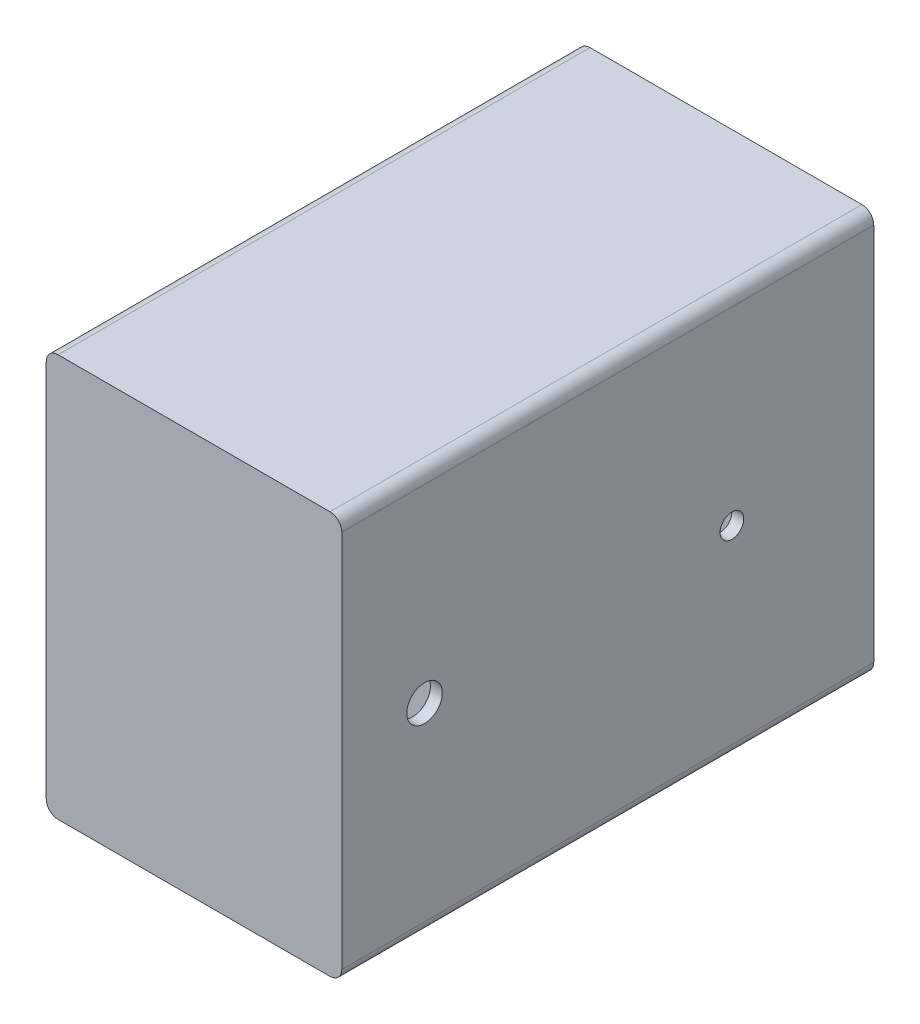
ISO-10303-21;
HEADER;
FILE_DESCRIPTION(('STEP AP214'),'2;1');
FILE_NAME('part.step','',(''),(''),'','','');
FILE_SCHEMA(('AUTOMOTIVE_DESIGN { 1 0 10303 214 1 1 1 1 }'));
ENDSEC;
DATA;
#1=APPLICATION_CONTEXT('core data for automotive mechanical design processes');
#2=APPLICATION_PROTOCOL_DEFINITION('international standard','automotive_design',2000,#1);
#3=PRODUCT_CONTEXT('',#1,'mechanical');
#4=PRODUCT('Part','Part','',(#3));
#5=PRODUCT_RELATED_PRODUCT_CATEGORY('part','',(#4));
#6=PRODUCT_DEFINITION_FORMATION('','',#4);
#7=PRODUCT_DEFINITION_CONTEXT('part definition',#1,'design');
#8=PRODUCT_DEFINITION('design','',#6,#7);
#9=PRODUCT_DEFINITION_SHAPE('','',#8);
#10=(LENGTH_UNIT() NAMED_UNIT(*) SI_UNIT(.MILLI.,.METRE.));
#11=(NAMED_UNIT(*) PLANE_ANGLE_UNIT() SI_UNIT($,.RADIAN.));
#12=(NAMED_UNIT(*) SI_UNIT($,.STERADIAN.) SOLID_ANGLE_UNIT());
#13=UNCERTAINTY_MEASURE_WITH_UNIT(LENGTH_MEASURE(1.E-05),#10,'distance_accuracy_value','');
#14=(GEOMETRIC_REPRESENTATION_CONTEXT(3) GLOBAL_UNCERTAINTY_ASSIGNED_CONTEXT((#13)) GLOBAL_UNIT_ASSIGNED_CONTEXT((#10,
#11,#12)) REPRESENTATION_CONTEXT('',''));
#15=CARTESIAN_POINT('',(0.,0.,0.));
#16=DIRECTION('',(0.,0.,1.));
#17=DIRECTION('',(1.,0.,0.));
#18=AXIS2_PLACEMENT_3D('',#15,#16,#17);
#19=CARTESIAN_POINT('',(115.,160.2,4.99999999999967));
#20=DIRECTION('',(1.,0.,0.));
#21=DIRECTION('',(0.,1.,0.));
#22=AXIS2_PLACEMENT_3D('',#19,#20,#21);
#23=PLANE('',#22);
#24=CARTESIAN_POINT('',(115.,0.,380.));
#25=DIRECTION('',(1.,0.,0.));
#26=DIRECTION('',(0.,1.,0.));
#27=AXIS2_PLACEMENT_3D('',#24,#25,#26);
#28=CIRCLE('',#27,15.);
#29=CARTESIAN_POINT('',(115.,15.,380.));
#30=VERTEX_POINT('',#29);
#31=EDGE_CURVE('E260',#30,#30,#28,.T.);
#32=ORIENTED_EDGE('',*,*,#31,.T.);
#33=EDGE_LOOP('',(#32));
#34=FACE_BOUND('',#33,.T.);
#35=DIRECTION('',(0.,0.,1.));
#36=VECTOR('',#35,1.);
#37=CARTESIAN_POINT('',(115.,160.2,4.99999999999967));
#38=LINE('',#37,#36);
#39=CARTESIAN_POINT('',(114.999999999999,160.2,330.));
#40=VERTEX_POINT('',#39);
#41=CARTESIAN_POINT('',(114.999999999999,160.2,445.));
#42=VERTEX_POINT('',#41);
#43=EDGE_CURVE('E306',#40,#42,#38,.T.);
#44=ORIENTED_EDGE('',*,*,#43,.F.);
#45=DIRECTION('',(0.,-1.,0.));
#46=VECTOR('',#45,1.);
#47=CARTESIAN_POINT('',(114.999999999999,160.2,330.));
#48=LINE('',#47,#46);
#49=CARTESIAN_POINT('',(115.,-160.2,330.));
#50=VERTEX_POINT('',#49);
#51=EDGE_CURVE('E249',#40,#50,#48,.T.);
#52=ORIENTED_EDGE('',*,*,#51,.T.);
#53=DIRECTION('',(0.,0.,1.));
#54=VECTOR('',#53,1.);
#55=CARTESIAN_POINT('',(115.,-160.2,4.99999999999967));
#56=LINE('',#55,#54);
#57=CARTESIAN_POINT('',(115.,-160.2,445.));
#58=VERTEX_POINT('',#57);
#59=EDGE_CURVE('E282',#50,#58,#56,.T.);
#60=ORIENTED_EDGE('',*,*,#59,.T.);
#61=DIRECTION('',(0.,1.,0.));
#62=VECTOR('',#61,1.);
#63=CARTESIAN_POINT('',(114.999999999999,160.2,445.));
#64=LINE('',#63,#62);
#65=EDGE_CURVE('E264',#58,#42,#64,.T.);
#66=ORIENTED_EDGE('',*,*,#65,.T.);
#67=EDGE_LOOP('',(#44,#52,#60,#66));
#68=FACE_BOUND('',#67,.T.);
#69=ADVANCED_FACE('F49',(#34,#68),#23,.F.);
#70=CARTESIAN_POINT('',(124.999999999999,170.2,450.));
#71=DIRECTION('',(-1.,0.,0.));
#72=DIRECTION('',(0.,-1.,0.));
#73=AXIS2_PLACEMENT_3D('',#70,#71,#72);
#74=PLANE('',#73);
#75=CARTESIAN_POINT('',(125.,0.,380.));
#76=DIRECTION('',(-1.,0.,0.));
#77=DIRECTION('',(0.,-1.,0.));
#78=AXIS2_PLACEMENT_3D('',#75,#76,#77);
#79=CIRCLE('',#78,15.);
#80=CARTESIAN_POINT('',(125.,-15.,380.));
#81=VERTEX_POINT('',#80);
#82=EDGE_CURVE('E253',#81,#81,#79,.T.);
#83=ORIENTED_EDGE('',*,*,#82,.T.);
#84=EDGE_LOOP('',(#83));
#85=FACE_BOUND('',#84,.T.);
#86=CARTESIAN_POINT('',(125.,0.,120.));
#87=DIRECTION('',(1.,0.,0.));
#88=DIRECTION('',(0.,-1.,0.));
#89=AXIS2_PLACEMENT_3D('',#86,#87,#88);
#90=CIRCLE('',#89,9.99999999999998);
#91=CARTESIAN_POINT('',(125.,-9.99999999999998,120.));
#92=VERTEX_POINT('',#91);
#93=EDGE_CURVE('E378',#92,#92,#90,.T.);
#94=ORIENTED_EDGE('',*,*,#93,.F.);
#95=EDGE_LOOP('',(#94));
#96=FACE_BOUND('',#95,.T.);
#97=DIRECTION('',(0.,1.,0.));
#98=VECTOR('',#97,1.);
#99=CARTESIAN_POINT('',(124.999999999999,170.2,450.));
#100=LINE('',#99,#98);
#101=CARTESIAN_POINT('',(125.,-160.2,450.));
#102=VERTEX_POINT('',#101);
#103=CARTESIAN_POINT('',(124.999999999999,160.2,450.));
#104=VERTEX_POINT('',#103);
#105=EDGE_CURVE('E404',#102,#104,#100,.T.);
#106=ORIENTED_EDGE('',*,*,#105,.F.);
#107=DIRECTION('',(0.,0.,-1.));
#108=VECTOR('',#107,1.);
#109=CARTESIAN_POINT('',(125.,-160.2,450.));
#110=LINE('',#109,#108);
#111=CARTESIAN_POINT('',(125.,-160.2,0.));
#112=VERTEX_POINT('',#111);
#113=EDGE_CURVE('E476',#102,#112,#110,.T.);
#114=ORIENTED_EDGE('',*,*,#113,.T.);
#115=DIRECTION('',(0.,1.,0.));
#116=VECTOR('',#115,1.);
#117=CARTESIAN_POINT('',(124.999999999999,170.2,0.));
#118=LINE('',#117,#116);
#119=CARTESIAN_POINT('',(124.999999999999,160.2,-3.33066907387547E-13));
#120=VERTEX_POINT('',#119);
#121=EDGE_CURVE('E403',#112,#120,#118,.T.);
#122=ORIENTED_EDGE('',*,*,#121,.T.);
#123=DIRECTION('',(0.,0.,-1.));
#124=VECTOR('',#123,1.);
#125=CARTESIAN_POINT('',(124.999999999999,160.2,450.));
#126=LINE('',#125,#124);
#127=EDGE_CURVE('E473',#120,#104,#126,.F.);
#128=ORIENTED_EDGE('',*,*,#127,.T.);
#129=EDGE_LOOP('',(#106,#114,#122,#128));
#130=FACE_BOUND('',#129,.T.);
#131=ADVANCED_FACE('F510',(#85,#96,#130),#74,.F.);
#132=CARTESIAN_POINT('',(-125.000000000001,170.2,450.));
#133=DIRECTION('',(0.,-1.,0.));
#134=DIRECTION('',(0.,0.,-1.));
#135=AXIS2_PLACEMENT_3D('',#132,#133,#134);
#136=PLANE('',#135);
#137=DIRECTION('',(-1.,0.,0.));
#138=VECTOR('',#137,1.);
#139=CARTESIAN_POINT('',(-125.000000000001,170.2,0.));
#140=LINE('',#139,#138);
#141=CARTESIAN_POINT('',(114.999999999999,170.2,-3.33066907387547E-13));
#142=VERTEX_POINT('',#141);
#143=CARTESIAN_POINT('',(-115.000000000001,170.2,0.));
#144=VERTEX_POINT('',#143);
#145=EDGE_CURVE('E425',#142,#144,#140,.T.);
#146=ORIENTED_EDGE('',*,*,#145,.T.);
#147=DIRECTION('',(0.,0.,-1.));
#148=VECTOR('',#147,1.);
#149=CARTESIAN_POINT('',(-115.000000000001,170.2,450.));
#150=LINE('',#149,#148);
#151=CARTESIAN_POINT('',(-115.000000000001,170.2,450.));
#152=VERTEX_POINT('',#151);
#153=EDGE_CURVE('E11',#144,#152,#150,.F.);
#154=ORIENTED_EDGE('',*,*,#153,.T.);
#155=DIRECTION('',(-1.,0.,0.));
#156=VECTOR('',#155,1.);
#157=CARTESIAN_POINT('',(-125.000000000001,170.2,450.));
#158=LINE('',#157,#156);
#159=CARTESIAN_POINT('',(114.999999999999,170.2,450.));
#160=VERTEX_POINT('',#159);
#161=EDGE_CURVE('E408',#160,#152,#158,.T.);
#162=ORIENTED_EDGE('',*,*,#161,.F.);
#163=DIRECTION('',(0.,0.,-1.));
#164=VECTOR('',#163,1.);
#165=CARTESIAN_POINT('',(114.999999999999,170.2,450.));
#166=LINE('',#165,#164);
#167=EDGE_CURVE('E59',#160,#142,#166,.T.);
#168=ORIENTED_EDGE('',*,*,#167,.T.);
#169=EDGE_LOOP('',(#146,#154,#162,#168));
#170=FACE_BOUND('',#169,.T.);
#171=ADVANCED_FACE('F517',(#170),#136,.F.);
#172=CARTESIAN_POINT('',(-125.000000000001,170.2,450.));
#173=DIRECTION('',(1.,0.,0.));
#174=DIRECTION('',(0.,1.,0.));
#175=AXIS2_PLACEMENT_3D('',#172,#173,#174);
#176=PLANE('',#175);
#177=CARTESIAN_POINT('',(-125.,0.,380.));
#178=DIRECTION('',(-1.,0.,0.));
#179=DIRECTION('',(0.,-1.,0.));
#180=AXIS2_PLACEMENT_3D('',#177,#178,#179);
#181=CIRCLE('',#180,15.);
#182=CARTESIAN_POINT('',(-125.,-15.,380.));
#183=VERTEX_POINT('',#182);
#184=EDGE_CURVE('E252',#183,#183,#181,.T.);
#185=ORIENTED_EDGE('',*,*,#184,.F.);
#186=EDGE_LOOP('',(#185));
#187=FACE_BOUND('',#186,.T.);
#188=DIRECTION('',(0.,-1.,0.));
#189=VECTOR('',#188,1.);
#190=CARTESIAN_POINT('',(-125.000000000001,170.2,0.));
#191=LINE('',#190,#189);
#192=CARTESIAN_POINT('',(-125.000000000001,160.2,-3.33066907387547E-13));
#193=VERTEX_POINT('',#192);
#194=CARTESIAN_POINT('',(-125.,-160.2,0.));
#195=VERTEX_POINT('',#194);
#196=EDGE_CURVE('E429',#193,#195,#191,.T.);
#197=ORIENTED_EDGE('',*,*,#196,.T.);
#198=DIRECTION('',(0.,0.,-1.));
#199=VECTOR('',#198,1.);
#200=CARTESIAN_POINT('',(-125.,-160.2,450.));
#201=LINE('',#200,#199);
#202=CARTESIAN_POINT('',(-125.,-160.2,450.));
#203=VERTEX_POINT('',#202);
#204=EDGE_CURVE('E458',#195,#203,#201,.F.);
#205=ORIENTED_EDGE('',*,*,#204,.T.);
#206=DIRECTION('',(0.,-1.,0.));
#207=VECTOR('',#206,1.);
#208=CARTESIAN_POINT('',(-125.000000000001,170.2,450.));
#209=LINE('',#208,#207);
#210=CARTESIAN_POINT('',(-125.000000000001,160.2,450.));
#211=VERTEX_POINT('',#210);
#212=EDGE_CURVE('E413',#211,#203,#209,.T.);
#213=ORIENTED_EDGE('',*,*,#212,.F.);
#214=DIRECTION('',(0.,0.,-1.));
#215=VECTOR('',#214,1.);
#216=CARTESIAN_POINT('',(-125.000000000001,160.2,450.));
#217=LINE('',#216,#215);
#218=EDGE_CURVE('E454',#211,#193,#217,.T.);
#219=ORIENTED_EDGE('',*,*,#218,.T.);
#220=EDGE_LOOP('',(#197,#205,#213,#219));
#221=FACE_BOUND('',#220,.T.);
#222=ADVANCED_FACE('F622',(#187,#221),#176,.F.);
#223=CARTESIAN_POINT('',(-125.000000000001,-170.2,450.));
#224=DIRECTION('',(0.,1.,0.));
#225=DIRECTION('',(0.,0.,1.));
#226=AXIS2_PLACEMENT_3D('',#223,#224,#225);
#227=PLANE('',#226);
#228=DIRECTION('',(1.,0.,0.));
#229=VECTOR('',#228,1.);
#230=CARTESIAN_POINT('',(-125.000000000001,-170.2,450.));
#231=LINE('',#230,#229);
#232=CARTESIAN_POINT('',(-115.000000000001,-170.2,450.));
#233=VERTEX_POINT('',#232);
#234=CARTESIAN_POINT('',(114.999999999999,-170.2,450.));
#235=VERTEX_POINT('',#234);
#236=EDGE_CURVE('E417',#233,#235,#231,.T.);
#237=ORIENTED_EDGE('',*,*,#236,.F.);
#238=DIRECTION('',(0.,0.,-1.));
#239=VECTOR('',#238,1.);
#240=CARTESIAN_POINT('',(-115.000000000001,-170.2,450.));
#241=LINE('',#240,#239);
#242=CARTESIAN_POINT('',(-115.,-170.2,0.));
#243=VERTEX_POINT('',#242);
#244=EDGE_CURVE('E438',#233,#243,#241,.T.);
#245=ORIENTED_EDGE('',*,*,#244,.T.);
#246=DIRECTION('',(1.,0.,0.));
#247=VECTOR('',#246,1.);
#248=CARTESIAN_POINT('',(-125.,-170.2,-3.33066907387547E-13));
#249=LINE('',#248,#247);
#250=CARTESIAN_POINT('',(115.,-170.2,-3.33066907387547E-13));
#251=VERTEX_POINT('',#250);
#252=EDGE_CURVE('E409',#243,#251,#249,.T.);
#253=ORIENTED_EDGE('',*,*,#252,.T.);
#254=DIRECTION('',(0.,0.,-1.));
#255=VECTOR('',#254,1.);
#256=CARTESIAN_POINT('',(114.999999999999,-170.2,450.));
#257=LINE('',#256,#255);
#258=EDGE_CURVE('E421',#251,#235,#257,.F.);
#259=ORIENTED_EDGE('',*,*,#258,.T.);
#260=EDGE_LOOP('',(#237,#245,#253,#259));
#261=FACE_BOUND('',#260,.T.);
#262=ADVANCED_FACE('F625',(#261),#227,.F.);
#263=CARTESIAN_POINT('',(0.,0.,450.));
#264=DIRECTION('',(0.,0.,1.));
#265=DIRECTION('',(1.,0.,0.));
#266=AXIS2_PLACEMENT_3D('',#263,#264,#265);
#267=PLANE('',#266);
#268=ORIENTED_EDGE('',*,*,#212,.T.);
#269=CARTESIAN_POINT('',(-115.,-160.2,450.));
#270=DIRECTION('',(0.,0.,1.));
#271=DIRECTION('',(1.,0.,0.));
#272=AXIS2_PLACEMENT_3D('',#269,#270,#271);
#273=CIRCLE('',#272,10.);
#274=EDGE_CURVE('E470',#203,#233,#273,.T.);
#275=ORIENTED_EDGE('',*,*,#274,.T.);
#276=ORIENTED_EDGE('',*,*,#236,.T.);
#277=CARTESIAN_POINT('',(115.,-160.2,450.));
#278=DIRECTION('',(0.,0.,1.));
#279=DIRECTION('',(1.,0.,0.));
#280=AXIS2_PLACEMENT_3D('',#277,#278,#279);
#281=CIRCLE('',#280,10.);
#282=EDGE_CURVE('E467',#235,#102,#281,.T.);
#283=ORIENTED_EDGE('',*,*,#282,.T.);
#284=ORIENTED_EDGE('',*,*,#105,.T.);
#285=CARTESIAN_POINT('',(114.999999999999,160.2,450.));
#286=DIRECTION('',(0.,0.,1.));
#287=DIRECTION('',(1.,0.,0.));
#288=AXIS2_PLACEMENT_3D('',#285,#286,#287);
#289=CIRCLE('',#288,10.);
#290=EDGE_CURVE('E461',#104,#160,#289,.T.);
#291=ORIENTED_EDGE('',*,*,#290,.T.);
#292=ORIENTED_EDGE('',*,*,#161,.T.);
#293=CARTESIAN_POINT('',(-115.000000000001,160.2,450.));
#294=DIRECTION('',(0.,0.,1.));
#295=DIRECTION('',(1.,0.,0.));
#296=AXIS2_PLACEMENT_3D('',#293,#294,#295);
#297=CIRCLE('',#296,10.);
#298=EDGE_CURVE('E464',#152,#211,#297,.T.);
#299=ORIENTED_EDGE('',*,*,#298,.T.);
#300=EDGE_LOOP('',(#268,#275,#276,#283,#284,#291,#292,#299));
#301=FACE_BOUND('',#300,.T.);
#302=ADVANCED_FACE('F638',(#301),#267,.T.);
#303=CARTESIAN_POINT('',(0.,0.,0.));
#304=DIRECTION('',(0.,0.,1.));
#305=DIRECTION('',(1.,0.,0.));
#306=AXIS2_PLACEMENT_3D('',#303,#304,#305);
#307=PLANE('',#306);
#308=DIRECTION('',(0.,-1.,0.));
#309=VECTOR('',#308,1.);
#310=CARTESIAN_POINT('',(40.4999999999993,-25.4999999999999,0.));
#311=LINE('',#310,#309);
#312=CARTESIAN_POINT('',(40.5,25.4999999999999,0.));
#313=VERTEX_POINT('',#312);
#314=CARTESIAN_POINT('',(40.4999999999993,-25.4999999999999,0.));
#315=VERTEX_POINT('',#314);
#316=EDGE_CURVE('E348',#313,#315,#311,.T.);
#317=ORIENTED_EDGE('',*,*,#316,.F.);
#318=CARTESIAN_POINT('',(30.5,25.5,0.));
#319=DIRECTION('',(0.,0.,-1.));
#320=DIRECTION('',(1.,0.,0.));
#321=AXIS2_PLACEMENT_3D('',#318,#319,#320);
#322=CIRCLE('',#321,10.);
#323=CARTESIAN_POINT('',(30.5,35.5,0.));
#324=VERTEX_POINT('',#323);
#325=EDGE_CURVE('E345',#324,#313,#322,.T.);
#326=ORIENTED_EDGE('',*,*,#325,.F.);
#327=DIRECTION('',(1.,0.,0.));
#328=VECTOR('',#327,1.);
#329=CARTESIAN_POINT('',(30.5,35.5,0.));
#330=LINE('',#329,#328);
#331=CARTESIAN_POINT('',(-30.5,35.5,-3.33066907387547E-13));
#332=VERTEX_POINT('',#331);
#333=EDGE_CURVE('E316',#332,#324,#330,.T.);
#334=ORIENTED_EDGE('',*,*,#333,.F.);
#335=CARTESIAN_POINT('',(-30.5,25.5,-3.33066907387547E-13));
#336=DIRECTION('',(0.,0.,-1.));
#337=DIRECTION('',(1.,0.,0.));
#338=AXIS2_PLACEMENT_3D('',#335,#336,#337);
#339=CIRCLE('',#338,10.);
#340=CARTESIAN_POINT('',(-40.5,25.4999999999999,0.));
#341=VERTEX_POINT('',#340);
#342=EDGE_CURVE('E368',#341,#332,#339,.T.);
#343=ORIENTED_EDGE('',*,*,#342,.F.);
#344=DIRECTION('',(0.,1.,0.));
#345=VECTOR('',#344,1.);
#346=CARTESIAN_POINT('',(-40.5000000000006,-25.4999999999999,0.));
#347=LINE('',#346,#345);
#348=CARTESIAN_POINT('',(-40.5000000000006,-25.4999999999999,0.));
#349=VERTEX_POINT('',#348);
#350=EDGE_CURVE('E364',#349,#341,#347,.T.);
#351=ORIENTED_EDGE('',*,*,#350,.F.);
#352=CARTESIAN_POINT('',(-30.5000000000006,-25.4999999999999,-3.33066907387547E-13));
#353=DIRECTION('',(0.,0.,-1.));
#354=DIRECTION('',(-1.,0.,0.));
#355=AXIS2_PLACEMENT_3D('',#352,#353,#354);
#356=CIRCLE('',#355,10.);
#357=CARTESIAN_POINT('',(-30.5,-35.4999999999999,0.));
#358=VERTEX_POINT('',#357);
#359=EDGE_CURVE('E360',#358,#349,#356,.T.);
#360=ORIENTED_EDGE('',*,*,#359,.F.);
#361=DIRECTION('',(-1.,0.,0.));
#362=VECTOR('',#361,1.);
#363=CARTESIAN_POINT('',(30.5,-35.5,0.));
#364=LINE('',#363,#362);
#365=CARTESIAN_POINT('',(30.5,-35.5,0.));
#366=VERTEX_POINT('',#365);
#367=EDGE_CURVE('E356',#366,#358,#364,.T.);
#368=ORIENTED_EDGE('',*,*,#367,.F.);
#369=CARTESIAN_POINT('',(30.4999999999993,-25.5,0.));
#370=DIRECTION('',(0.,0.,-1.));
#371=DIRECTION('',(1.,0.,0.));
#372=AXIS2_PLACEMENT_3D('',#369,#370,#371);
#373=CIRCLE('',#372,10.);
#374=EDGE_CURVE('E352',#315,#366,#373,.T.);
#375=ORIENTED_EDGE('',*,*,#374,.F.);
#376=EDGE_LOOP('',(#317,#326,#334,#343,#351,#360,#368,#375));
#377=FACE_BOUND('',#376,.T.);
#378=ORIENTED_EDGE('',*,*,#252,.F.);
#379=CARTESIAN_POINT('',(-115.,-160.2,0.));
#380=DIRECTION('',(0.,0.,1.));
#381=DIRECTION('',(1.,0.,0.));
#382=AXIS2_PLACEMENT_3D('',#379,#380,#381);
#383=CIRCLE('',#382,10.);
#384=EDGE_CURVE('E451',#243,#195,#383,.F.);
#385=ORIENTED_EDGE('',*,*,#384,.T.);
#386=ORIENTED_EDGE('',*,*,#196,.F.);
#387=CARTESIAN_POINT('',(-115.000000000001,160.2,0.));
#388=DIRECTION('',(0.,0.,1.));
#389=DIRECTION('',(1.,0.,0.));
#390=AXIS2_PLACEMENT_3D('',#387,#388,#389);
#391=CIRCLE('',#390,10.);
#392=EDGE_CURVE('E445',#193,#144,#391,.F.);
#393=ORIENTED_EDGE('',*,*,#392,.T.);
#394=ORIENTED_EDGE('',*,*,#145,.F.);
#395=CARTESIAN_POINT('',(114.999999999999,160.2,-3.33066907387547E-13));
#396=DIRECTION('',(0.,0.,1.));
#397=DIRECTION('',(1.,0.,0.));
#398=AXIS2_PLACEMENT_3D('',#395,#396,#397);
#399=CIRCLE('',#398,10.);
#400=EDGE_CURVE('E442',#142,#120,#399,.F.);
#401=ORIENTED_EDGE('',*,*,#400,.T.);
#402=ORIENTED_EDGE('',*,*,#121,.F.);
#403=CARTESIAN_POINT('',(115.,-160.2,-3.33066907387547E-13));
#404=DIRECTION('',(0.,0.,1.));
#405=DIRECTION('',(1.,0.,0.));
#406=AXIS2_PLACEMENT_3D('',#403,#404,#405);
#407=CIRCLE('',#406,10.);
#408=EDGE_CURVE('E448',#112,#251,#407,.F.);
#409=ORIENTED_EDGE('',*,*,#408,.T.);
#410=EDGE_LOOP('',(#378,#385,#386,#393,#394,#401,#402,#409));
#411=FACE_BOUND('',#410,.T.);
#412=ADVANCED_FACE('F660',(#377,#411),#307,.F.);
#413=CARTESIAN_POINT('',(-115.,-160.2,450.));
#414=DIRECTION('',(0.,0.,-1.));
#415=DIRECTION('',(-1.,0.,0.));
#416=AXIS2_PLACEMENT_3D('',#413,#414,#415);
#417=CYLINDRICAL_SURFACE('',#416,10.);
#418=ORIENTED_EDGE('',*,*,#274,.F.);
#419=ORIENTED_EDGE('',*,*,#204,.F.);
#420=ORIENTED_EDGE('',*,*,#384,.F.);
#421=ORIENTED_EDGE('',*,*,#244,.F.);
#422=EDGE_LOOP('',(#418,#419,#420,#421));
#423=FACE_BOUND('',#422,.T.);
#424=ADVANCED_FACE('F634',(#423),#417,.T.);
#425=CARTESIAN_POINT('',(115.,-160.2,450.));
#426=DIRECTION('',(0.,0.,-1.));
#427=DIRECTION('',(-1.,0.,0.));
#428=AXIS2_PLACEMENT_3D('',#425,#426,#427);
#429=CYLINDRICAL_SURFACE('',#428,10.);
#430=ORIENTED_EDGE('',*,*,#282,.F.);
#431=ORIENTED_EDGE('',*,*,#258,.F.);
#432=ORIENTED_EDGE('',*,*,#408,.F.);
#433=ORIENTED_EDGE('',*,*,#113,.F.);
#434=EDGE_LOOP('',(#430,#431,#432,#433));
#435=FACE_BOUND('',#434,.T.);
#436=ADVANCED_FACE('F644',(#435),#429,.T.);
#437=CARTESIAN_POINT('',(-115.000000000001,160.2,450.));
#438=DIRECTION('',(0.,0.,-1.));
#439=DIRECTION('',(-1.,0.,0.));
#440=AXIS2_PLACEMENT_3D('',#437,#438,#439);
#441=CYLINDRICAL_SURFACE('',#440,10.);
#442=ORIENTED_EDGE('',*,*,#298,.F.);
#443=ORIENTED_EDGE('',*,*,#153,.F.);
#444=ORIENTED_EDGE('',*,*,#392,.F.);
#445=ORIENTED_EDGE('',*,*,#218,.F.);
#446=EDGE_LOOP('',(#442,#443,#444,#445));
#447=FACE_BOUND('',#446,.T.);
#448=ADVANCED_FACE('F659',(#447),#441,.T.);
#449=CARTESIAN_POINT('',(114.999999999999,160.2,450.));
#450=DIRECTION('',(0.,0.,-1.));
#451=DIRECTION('',(-1.,0.,0.));
#452=AXIS2_PLACEMENT_3D('',#449,#450,#451);
#453=CYLINDRICAL_SURFACE('',#452,10.);
#454=ORIENTED_EDGE('',*,*,#290,.F.);
#455=ORIENTED_EDGE('',*,*,#127,.F.);
#456=ORIENTED_EDGE('',*,*,#400,.F.);
#457=ORIENTED_EDGE('',*,*,#167,.F.);
#458=EDGE_LOOP('',(#454,#455,#456,#457));
#459=FACE_BOUND('',#458,.T.);
#460=ADVANCED_FACE('F51',(#459),#453,.T.);
#461=CARTESIAN_POINT('',(75.,0.,120.));
#462=DIRECTION('',(1.,0.,0.));
#463=DIRECTION('',(0.,1.,0.));
#464=AXIS2_PLACEMENT_3D('',#461,#462,#463);
#465=CYLINDRICAL_SURFACE('',#464,9.99999999999998);
#466=CARTESIAN_POINT('',(115.,0.,120.));
#467=DIRECTION('',(1.,0.,0.));
#468=DIRECTION('',(0.,1.,0.));
#469=AXIS2_PLACEMENT_3D('',#466,#467,#468);
#470=CIRCLE('',#469,9.99999999999998);
#471=CARTESIAN_POINT('',(115.,9.99999999999998,120.));
#472=VERTEX_POINT('',#471);
#473=EDGE_CURVE('E300',#472,#472,#470,.F.);
#474=ORIENTED_EDGE('',*,*,#473,.T.);
#475=EDGE_LOOP('',(#474));
#476=FACE_BOUND('',#475,.T.);
#477=ORIENTED_EDGE('',*,*,#93,.T.);
#478=EDGE_LOOP('',(#477));
#479=FACE_BOUND('',#478,.T.);
#480=ADVANCED_FACE('F487',(#476,#479),#465,.F.);
#481=CARTESIAN_POINT('',(30.5,25.5,1.));
#482=DIRECTION('',(0.,0.,-1.));
#483=DIRECTION('',(-1.,0.,0.));
#484=AXIS2_PLACEMENT_3D('',#481,#482,#483);
#485=CYLINDRICAL_SURFACE('',#484,10.);
#486=ORIENTED_EDGE('',*,*,#325,.T.);
#487=DIRECTION('',(0.,0.,-1.));
#488=VECTOR('',#487,1.);
#489=CARTESIAN_POINT('',(40.5,25.4999999999999,1.));
#490=LINE('',#489,#488);
#491=CARTESIAN_POINT('',(40.5,25.4999999999999,1.));
#492=VERTEX_POINT('',#491);
#493=EDGE_CURVE('E344',#492,#313,#490,.T.);
#494=ORIENTED_EDGE('',*,*,#493,.F.);
#495=CARTESIAN_POINT('',(30.5,25.5,1.));
#496=DIRECTION('',(0.,0.,-1.));
#497=DIRECTION('',(1.,0.,0.));
#498=AXIS2_PLACEMENT_3D('',#495,#496,#497);
#499=CIRCLE('',#498,10.);
#500=CARTESIAN_POINT('',(30.5,35.5,1.));
#501=VERTEX_POINT('',#500);
#502=EDGE_CURVE('E311',#501,#492,#499,.T.);
#503=ORIENTED_EDGE('',*,*,#502,.F.);
#504=DIRECTION('',(0.,0.,-1.));
#505=VECTOR('',#504,1.);
#506=CARTESIAN_POINT('',(30.5,35.5,1.));
#507=LINE('',#506,#505);
#508=EDGE_CURVE('E375',#501,#324,#507,.T.);
#509=ORIENTED_EDGE('',*,*,#508,.T.);
#510=EDGE_LOOP('',(#486,#494,#503,#509));
#511=FACE_BOUND('',#510,.T.);
#512=ADVANCED_FACE('F688',(#511),#485,.F.);
#513=CARTESIAN_POINT('',(30.5,35.5,1.));
#514=DIRECTION('',(0.,1.,0.));
#515=DIRECTION('',(0.,0.,1.));
#516=AXIS2_PLACEMENT_3D('',#513,#514,#515);
#517=PLANE('',#516);
#518=ORIENTED_EDGE('',*,*,#333,.T.);
#519=ORIENTED_EDGE('',*,*,#508,.F.);
#520=DIRECTION('',(1.,0.,0.));
#521=VECTOR('',#520,1.);
#522=CARTESIAN_POINT('',(30.5,35.5,1.));
#523=LINE('',#522,#521);
#524=CARTESIAN_POINT('',(-30.5,35.5,0.999999999999668));
#525=VERTEX_POINT('',#524);
#526=EDGE_CURVE('E340',#525,#501,#523,.T.);
#527=ORIENTED_EDGE('',*,*,#526,.F.);
#528=DIRECTION('',(0.,0.,-1.));
#529=VECTOR('',#528,1.);
#530=CARTESIAN_POINT('',(-30.5,35.5,0.999999999999668));
#531=LINE('',#530,#529);
#532=EDGE_CURVE('E379',#525,#332,#531,.T.);
#533=ORIENTED_EDGE('',*,*,#532,.T.);
#534=EDGE_LOOP('',(#518,#519,#527,#533));
#535=FACE_BOUND('',#534,.T.);
#536=ADVANCED_FACE('F693',(#535),#517,.F.);
#537=CARTESIAN_POINT('',(-30.5,25.5,0.999999999999668));
#538=DIRECTION('',(0.,0.,-1.));
#539=DIRECTION('',(-1.,0.,0.));
#540=AXIS2_PLACEMENT_3D('',#537,#538,#539);
#541=CYLINDRICAL_SURFACE('',#540,10.);
#542=ORIENTED_EDGE('',*,*,#342,.T.);
#543=ORIENTED_EDGE('',*,*,#532,.F.);
#544=CARTESIAN_POINT('',(-30.5,25.5,0.999999999999668));
#545=DIRECTION('',(0.,0.,-1.));
#546=DIRECTION('',(1.,0.,0.));
#547=AXIS2_PLACEMENT_3D('',#544,#545,#546);
#548=CIRCLE('',#547,10.);
#549=CARTESIAN_POINT('',(-40.5,25.4999999999999,1.));
#550=VERTEX_POINT('',#549);
#551=EDGE_CURVE('E336',#550,#525,#548,.T.);
#552=ORIENTED_EDGE('',*,*,#551,.F.);
#553=DIRECTION('',(0.,0.,-1.));
#554=VECTOR('',#553,1.);
#555=CARTESIAN_POINT('',(-40.5,25.4999999999999,1.));
#556=LINE('',#555,#554);
#557=EDGE_CURVE('E382',#550,#341,#556,.T.);
#558=ORIENTED_EDGE('',*,*,#557,.T.);
#559=EDGE_LOOP('',(#542,#543,#552,#558));
#560=FACE_BOUND('',#559,.T.);
#561=ADVANCED_FACE('F714',(#560),#541,.F.);
#562=CARTESIAN_POINT('',(-40.5000000000006,-25.4999999999999,1.));
#563=DIRECTION('',(-1.,0.,0.));
#564=DIRECTION('',(0.,0.,1.));
#565=AXIS2_PLACEMENT_3D('',#562,#563,#564);
#566=PLANE('',#565);
#567=ORIENTED_EDGE('',*,*,#350,.T.);
#568=ORIENTED_EDGE('',*,*,#557,.F.);
#569=DIRECTION('',(0.,1.,0.));
#570=VECTOR('',#569,1.);
#571=CARTESIAN_POINT('',(-40.5000000000006,-25.4999999999999,1.));
#572=LINE('',#571,#570);
#573=CARTESIAN_POINT('',(-40.5000000000006,-25.5,1.));
#574=VERTEX_POINT('',#573);
#575=EDGE_CURVE('E332',#574,#550,#572,.T.);
#576=ORIENTED_EDGE('',*,*,#575,.F.);
#577=DIRECTION('',(0.,0.,-1.));
#578=VECTOR('',#577,1.);
#579=CARTESIAN_POINT('',(-40.5000000000006,-25.5,1.));
#580=LINE('',#579,#578);
#581=EDGE_CURVE('E385',#574,#349,#580,.T.);
#582=ORIENTED_EDGE('',*,*,#581,.T.);
#583=EDGE_LOOP('',(#567,#568,#576,#582));
#584=FACE_BOUND('',#583,.T.);
#585=ADVANCED_FACE('F710',(#584),#566,.F.);
#586=CARTESIAN_POINT('',(-30.5000000000006,-25.5,0.999999999999668));
#587=DIRECTION('',(0.,0.,-1.));
#588=DIRECTION('',(-1.,0.,0.));
#589=AXIS2_PLACEMENT_3D('',#586,#587,#588);
#590=CYLINDRICAL_SURFACE('',#589,10.);
#591=ORIENTED_EDGE('',*,*,#359,.T.);
#592=ORIENTED_EDGE('',*,*,#581,.F.);
#593=CARTESIAN_POINT('',(-30.5000000000006,-25.5,0.999999999999668));
#594=DIRECTION('',(0.,0.,-1.));
#595=DIRECTION('',(-1.,0.,0.));
#596=AXIS2_PLACEMENT_3D('',#593,#594,#595);
#597=CIRCLE('',#596,10.);
#598=CARTESIAN_POINT('',(-30.5,-35.5,1.));
#599=VERTEX_POINT('',#598);
#600=EDGE_CURVE('E328',#599,#574,#597,.T.);
#601=ORIENTED_EDGE('',*,*,#600,.F.);
#602=DIRECTION('',(0.,0.,-1.));
#603=VECTOR('',#602,1.);
#604=CARTESIAN_POINT('',(-30.5,-35.5,1.));
#605=LINE('',#604,#603);
#606=EDGE_CURVE('E388',#599,#358,#605,.T.);
#607=ORIENTED_EDGE('',*,*,#606,.T.);
#608=EDGE_LOOP('',(#591,#592,#601,#607));
#609=FACE_BOUND('',#608,.T.);
#610=ADVANCED_FACE('F706',(#609),#590,.F.);
#611=CARTESIAN_POINT('',(30.5,-35.5,1.));
#612=DIRECTION('',(0.,-1.,0.));
#613=DIRECTION('',(0.,0.,-1.));
#614=AXIS2_PLACEMENT_3D('',#611,#612,#613);
#615=PLANE('',#614);
#616=ORIENTED_EDGE('',*,*,#367,.T.);
#617=ORIENTED_EDGE('',*,*,#606,.F.);
#618=DIRECTION('',(-1.,0.,0.));
#619=VECTOR('',#618,1.);
#620=CARTESIAN_POINT('',(30.5,-35.5,1.));
#621=LINE('',#620,#619);
#622=CARTESIAN_POINT('',(30.5,-35.5,1.));
#623=VERTEX_POINT('',#622);
#624=EDGE_CURVE('E324',#623,#599,#621,.T.);
#625=ORIENTED_EDGE('',*,*,#624,.F.);
#626=DIRECTION('',(0.,0.,-1.));
#627=VECTOR('',#626,1.);
#628=CARTESIAN_POINT('',(30.5,-35.5,1.));
#629=LINE('',#628,#627);
#630=EDGE_CURVE('E391',#623,#366,#629,.T.);
#631=ORIENTED_EDGE('',*,*,#630,.T.);
#632=EDGE_LOOP('',(#616,#617,#625,#631));
#633=FACE_BOUND('',#632,.T.);
#634=ADVANCED_FACE('F703',(#633),#615,.F.);
#635=CARTESIAN_POINT('',(30.4999999999993,-25.5,1.));
#636=DIRECTION('',(0.,0.,-1.));
#637=DIRECTION('',(-1.,0.,0.));
#638=AXIS2_PLACEMENT_3D('',#635,#636,#637);
#639=CYLINDRICAL_SURFACE('',#638,10.);
#640=ORIENTED_EDGE('',*,*,#374,.T.);
#641=ORIENTED_EDGE('',*,*,#630,.F.);
#642=CARTESIAN_POINT('',(30.4999999999993,-25.5,1.));
#643=DIRECTION('',(0.,0.,-1.));
#644=DIRECTION('',(1.,0.,0.));
#645=AXIS2_PLACEMENT_3D('',#642,#643,#644);
#646=CIRCLE('',#645,10.);
#647=CARTESIAN_POINT('',(40.4999999999993,-25.4999999999999,1.));
#648=VERTEX_POINT('',#647);
#649=EDGE_CURVE('E320',#648,#623,#646,.T.);
#650=ORIENTED_EDGE('',*,*,#649,.F.);
#651=DIRECTION('',(0.,0.,-1.));
#652=VECTOR('',#651,1.);
#653=CARTESIAN_POINT('',(40.4999999999993,-25.4999999999999,1.));
#654=LINE('',#653,#652);
#655=EDGE_CURVE('E394',#648,#315,#654,.T.);
#656=ORIENTED_EDGE('',*,*,#655,.T.);
#657=EDGE_LOOP('',(#640,#641,#650,#656));
#658=FACE_BOUND('',#657,.T.);
#659=ADVANCED_FACE('F699',(#658),#639,.F.);
#660=CARTESIAN_POINT('',(40.4999999999993,-25.4999999999999,1.));
#661=DIRECTION('',(1.,0.,0.));
#662=DIRECTION('',(0.,0.,-1.));
#663=AXIS2_PLACEMENT_3D('',#660,#661,#662);
#664=PLANE('',#663);
#665=ORIENTED_EDGE('',*,*,#316,.T.);
#666=ORIENTED_EDGE('',*,*,#655,.F.);
#667=DIRECTION('',(0.,-1.,0.));
#668=VECTOR('',#667,1.);
#669=CARTESIAN_POINT('',(40.4999999999993,-25.4999999999999,1.));
#670=LINE('',#669,#668);
#671=EDGE_CURVE('E315',#492,#648,#670,.T.);
#672=ORIENTED_EDGE('',*,*,#671,.F.);
#673=ORIENTED_EDGE('',*,*,#493,.T.);
#674=EDGE_LOOP('',(#665,#666,#672,#673));
#675=FACE_BOUND('',#674,.T.);
#676=ADVANCED_FACE('F505',(#675),#664,.F.);
#677=CARTESIAN_POINT('',(30.5,25.5,1.));
#678=DIRECTION('',(0.,0.,1.));
#679=DIRECTION('',(1.,0.,0.));
#680=AXIS2_PLACEMENT_3D('',#677,#678,#679);
#681=PLANE('',#680);
#682=ORIENTED_EDGE('',*,*,#502,.T.);
#683=ORIENTED_EDGE('',*,*,#671,.T.);
#684=ORIENTED_EDGE('',*,*,#649,.T.);
#685=ORIENTED_EDGE('',*,*,#624,.T.);
#686=ORIENTED_EDGE('',*,*,#600,.T.);
#687=ORIENTED_EDGE('',*,*,#575,.T.);
#688=ORIENTED_EDGE('',*,*,#551,.T.);
#689=ORIENTED_EDGE('',*,*,#526,.T.);
#690=EDGE_LOOP('',(#682,#683,#684,#685,#686,#687,#688,#689));
#691=FACE_BOUND('',#690,.T.);
#692=ADVANCED_FACE('F493',(#691),#681,.F.);
#693=CARTESIAN_POINT('',(115.,-160.2,4.99999999999967));
#694=VERTEX_POINT('',#693);
#695=CARTESIAN_POINT('',(115.,-160.2,322.));
#696=VERTEX_POINT('',#695);
#697=EDGE_CURVE('E307',#694,#696,#56,.T.);
#698=ORIENTED_EDGE('',*,*,#697,.T.);
#699=DIRECTION('',(0.,1.,0.));
#700=VECTOR('',#699,1.);
#701=CARTESIAN_POINT('',(114.999999999999,160.2,322.));
#702=LINE('',#701,#700);
#703=CARTESIAN_POINT('',(114.999999999999,160.2,322.));
#704=VERTEX_POINT('',#703);
#705=EDGE_CURVE('E243',#696,#704,#702,.T.);
#706=ORIENTED_EDGE('',*,*,#705,.T.);
#707=CARTESIAN_POINT('',(115.,160.2,4.99999999999967));
#708=VERTEX_POINT('',#707);
#709=EDGE_CURVE('E218',#708,#704,#38,.T.);
#710=ORIENTED_EDGE('',*,*,#709,.F.);
#711=DIRECTION('',(0.,1.,0.));
#712=VECTOR('',#711,1.);
#713=CARTESIAN_POINT('',(115.,160.2,4.99999999999967));
#714=LINE('',#713,#712);
#715=EDGE_CURVE('E269',#694,#708,#714,.T.);
#716=ORIENTED_EDGE('',*,*,#715,.F.);
#717=EDGE_LOOP('',(#698,#706,#710,#716));
#718=FACE_BOUND('',#717,.T.);
#719=ORIENTED_EDGE('',*,*,#473,.F.);
#720=EDGE_LOOP('',(#719));
#721=FACE_BOUND('',#720,.T.);
#722=ADVANCED_FACE('F490',(#718,#721),#23,.F.);
#723=CARTESIAN_POINT('',(-18.2955267332747,-160.2,5.));
#724=DIRECTION('',(0.,-1.,0.));
#725=DIRECTION('',(0.,0.,-1.));
#726=AXIS2_PLACEMENT_3D('',#723,#724,#725);
#727=PLANE('',#726);
#728=ORIENTED_EDGE('',*,*,#59,.F.);
#729=DIRECTION('',(1.,0.,0.));
#730=VECTOR('',#729,1.);
#731=CARTESIAN_POINT('',(-115.,-160.2,330.));
#732=LINE('',#731,#730);
#733=CARTESIAN_POINT('',(-115.,-160.2,330.));
#734=VERTEX_POINT('',#733);
#735=EDGE_CURVE('E67',#734,#50,#732,.T.);
#736=ORIENTED_EDGE('',*,*,#735,.F.);
#737=DIRECTION('',(0.,0.,-1.));
#738=VECTOR('',#737,1.);
#739=CARTESIAN_POINT('',(-115.,-160.2,330.));
#740=LINE('',#739,#738);
#741=CARTESIAN_POINT('',(-115.,-160.2,322.));
#742=VERTEX_POINT('',#741);
#743=EDGE_CURVE('E71',#734,#742,#740,.T.);
#744=ORIENTED_EDGE('',*,*,#743,.T.);
#745=DIRECTION('',(1.,0.,0.));
#746=VECTOR('',#745,1.);
#747=CARTESIAN_POINT('',(-115.,-160.2,322.));
#748=LINE('',#747,#746);
#749=EDGE_CURVE('E223',#742,#696,#748,.T.);
#750=ORIENTED_EDGE('',*,*,#749,.T.);
#751=ORIENTED_EDGE('',*,*,#697,.F.);
#752=DIRECTION('',(1.,0.,0.));
#753=VECTOR('',#752,1.);
#754=CARTESIAN_POINT('',(-18.2955267332747,-160.2,5.));
#755=LINE('',#754,#753);
#756=CARTESIAN_POINT('',(-120.,-160.2,5.));
#757=VERTEX_POINT('',#756);
#758=EDGE_CURVE('E265',#757,#694,#755,.T.);
#759=ORIENTED_EDGE('',*,*,#758,.F.);
#760=DIRECTION('',(0.,0.,1.));
#761=VECTOR('',#760,1.);
#762=CARTESIAN_POINT('',(-120.,-160.2,5.));
#763=LINE('',#762,#761);
#764=CARTESIAN_POINT('',(-120.,-160.2,445.));
#765=VERTEX_POINT('',#764);
#766=EDGE_CURVE('E297',#757,#765,#763,.T.);
#767=ORIENTED_EDGE('',*,*,#766,.T.);
#768=DIRECTION('',(1.,0.,0.));
#769=VECTOR('',#768,1.);
#770=CARTESIAN_POINT('',(-18.2955267332747,-160.2,445.));
#771=LINE('',#770,#769);
#772=EDGE_CURVE('E270',#765,#58,#771,.T.);
#773=ORIENTED_EDGE('',*,*,#772,.T.);
#774=EDGE_LOOP('',(#728,#736,#744,#750,#751,#759,#767,#773));
#775=FACE_BOUND('',#774,.T.);
#776=ADVANCED_FACE('F492',(#775),#727,.F.);
#777=CARTESIAN_POINT('',(-120.,-160.2,5.));
#778=DIRECTION('',(-1.,0.,0.));
#779=DIRECTION('',(0.,0.,1.));
#780=AXIS2_PLACEMENT_3D('',#777,#778,#779);
#781=PLANE('',#780);
#782=CARTESIAN_POINT('',(-120.,-1.66533453693773E-13,380.));
#783=DIRECTION('',(-1.,0.,0.));
#784=DIRECTION('',(0.,0.,1.));
#785=AXIS2_PLACEMENT_3D('',#782,#783,#784);
#786=CIRCLE('',#785,15.);
#787=CARTESIAN_POINT('',(-120.,-1.66533453692709E-13,395.));
#788=VERTEX_POINT('',#787);
#789=EDGE_CURVE('E53',#788,#788,#786,.T.);
#790=ORIENTED_EDGE('',*,*,#789,.T.);
#791=EDGE_LOOP('',(#790));
#792=FACE_BOUND('',#791,.T.);
#793=DIRECTION('',(0.,-1.,0.));
#794=VECTOR('',#793,1.);
#795=CARTESIAN_POINT('',(-120.,-160.2,445.));
#796=LINE('',#795,#794);
#797=CARTESIAN_POINT('',(-120.000000000001,160.2,445.));
#798=VERTEX_POINT('',#797);
#799=EDGE_CURVE('E290',#798,#765,#796,.T.);
#800=ORIENTED_EDGE('',*,*,#799,.T.);
#801=ORIENTED_EDGE('',*,*,#766,.F.);
#802=DIRECTION('',(0.,-1.,0.));
#803=VECTOR('',#802,1.);
#804=CARTESIAN_POINT('',(-120.,-160.2,5.));
#805=LINE('',#804,#803);
#806=CARTESIAN_POINT('',(-120.,160.2,5.));
#807=VERTEX_POINT('',#806);
#808=EDGE_CURVE('E278',#807,#757,#805,.T.);
#809=ORIENTED_EDGE('',*,*,#808,.F.);
#810=DIRECTION('',(0.,0.,1.));
#811=VECTOR('',#810,1.);
#812=CARTESIAN_POINT('',(-120.,160.2,5.));
#813=LINE('',#812,#811);
#814=EDGE_CURVE('E301',#807,#798,#813,.T.);
#815=ORIENTED_EDGE('',*,*,#814,.T.);
#816=EDGE_LOOP('',(#800,#801,#809,#815));
#817=FACE_BOUND('',#816,.T.);
#818=ADVANCED_FACE('F502',(#792,#817),#781,.F.);
#819=CARTESIAN_POINT('',(-120.,160.2,5.));
#820=DIRECTION('',(0.,1.,0.));
#821=DIRECTION('',(0.,0.,1.));
#822=AXIS2_PLACEMENT_3D('',#819,#820,#821);
#823=PLANE('',#822);
#824=DIRECTION('',(0.,0.,1.));
#825=VECTOR('',#824,1.);
#826=CARTESIAN_POINT('',(-115.000000000001,160.2,322.));
#827=LINE('',#826,#825);
#828=CARTESIAN_POINT('',(-115.000000000001,160.2,322.));
#829=VERTEX_POINT('',#828);
#830=CARTESIAN_POINT('',(-115.000000000001,160.2,330.));
#831=VERTEX_POINT('',#830);
#832=EDGE_CURVE('E215',#829,#831,#827,.T.);
#833=ORIENTED_EDGE('',*,*,#832,.T.);
#834=DIRECTION('',(1.,0.,0.));
#835=VECTOR('',#834,1.);
#836=CARTESIAN_POINT('',(-115.000000000001,160.2,330.));
#837=LINE('',#836,#835);
#838=EDGE_CURVE('E222',#831,#40,#837,.T.);
#839=ORIENTED_EDGE('',*,*,#838,.T.);
#840=ORIENTED_EDGE('',*,*,#43,.T.);
#841=DIRECTION('',(-1.,0.,0.));
#842=VECTOR('',#841,1.);
#843=CARTESIAN_POINT('',(-120.000000000001,160.2,445.));
#844=LINE('',#843,#842);
#845=EDGE_CURVE('E286',#42,#798,#844,.T.);
#846=ORIENTED_EDGE('',*,*,#845,.T.);
#847=ORIENTED_EDGE('',*,*,#814,.F.);
#848=DIRECTION('',(-1.,0.,0.));
#849=VECTOR('',#848,1.);
#850=CARTESIAN_POINT('',(-120.,160.2,5.));
#851=LINE('',#850,#849);
#852=EDGE_CURVE('E274',#708,#807,#851,.T.);
#853=ORIENTED_EDGE('',*,*,#852,.F.);
#854=ORIENTED_EDGE('',*,*,#709,.T.);
#855=DIRECTION('',(1.,0.,0.));
#856=VECTOR('',#855,1.);
#857=CARTESIAN_POINT('',(-115.000000000001,160.2,322.));
#858=LINE('',#857,#856);
#859=EDGE_CURVE('E211',#829,#704,#858,.T.);
#860=ORIENTED_EDGE('',*,*,#859,.F.);
#861=EDGE_LOOP('',(#833,#839,#840,#846,#847,#853,#854,#860));
#862=FACE_BOUND('',#861,.T.);
#863=ADVANCED_FACE('F213',(#862),#823,.F.);
#864=CARTESIAN_POINT('',(0.,0.,5.));
#865=DIRECTION('',(0.,0.,-1.));
#866=DIRECTION('',(-1.,0.,0.));
#867=AXIS2_PLACEMENT_3D('',#864,#865,#866);
#868=PLANE('',#867);
#869=ORIENTED_EDGE('',*,*,#758,.T.);
#870=ORIENTED_EDGE('',*,*,#715,.T.);
#871=ORIENTED_EDGE('',*,*,#852,.T.);
#872=ORIENTED_EDGE('',*,*,#808,.T.);
#873=EDGE_LOOP('',(#869,#870,#871,#872));
#874=FACE_BOUND('',#873,.T.);
#875=ADVANCED_FACE('F548',(#874),#868,.F.);
#876=CARTESIAN_POINT('',(0.,0.,445.));
#877=DIRECTION('',(0.,0.,-1.));
#878=DIRECTION('',(-1.,0.,0.));
#879=AXIS2_PLACEMENT_3D('',#876,#877,#878);
#880=PLANE('',#879);
#881=ORIENTED_EDGE('',*,*,#772,.F.);
#882=ORIENTED_EDGE('',*,*,#799,.F.);
#883=ORIENTED_EDGE('',*,*,#845,.F.);
#884=ORIENTED_EDGE('',*,*,#65,.F.);
#885=EDGE_LOOP('',(#881,#882,#883,#884));
#886=FACE_BOUND('',#885,.T.);
#887=ADVANCED_FACE('F551',(#886),#880,.T.);
#888=CARTESIAN_POINT('',(125.,0.,380.));
#889=DIRECTION('',(-1.,0.,0.));
#890=DIRECTION('',(0.,-1.,0.));
#891=AXIS2_PLACEMENT_3D('',#888,#889,#890);
#892=CYLINDRICAL_SURFACE('',#891,15.);
#893=ORIENTED_EDGE('',*,*,#184,.T.);
#894=EDGE_LOOP('',(#893));
#895=FACE_BOUND('',#894,.T.);
#896=ORIENTED_EDGE('',*,*,#789,.F.);
#897=EDGE_LOOP('',(#896));
#898=FACE_BOUND('',#897,.T.);
#899=ADVANCED_FACE('F543',(#895,#898),#892,.F.);
#900=ORIENTED_EDGE('',*,*,#82,.F.);
#901=EDGE_LOOP('',(#900));
#902=FACE_BOUND('',#901,.T.);
#903=ORIENTED_EDGE('',*,*,#31,.F.);
#904=EDGE_LOOP('',(#903));
#905=FACE_BOUND('',#904,.T.);
#906=ADVANCED_FACE('F536',(#902,#905),#892,.F.);
#907=CARTESIAN_POINT('',(-115.000000000001,160.2,330.));
#908=DIRECTION('',(0.,0.,1.));
#909=DIRECTION('',(0.,-1.,0.));
#910=AXIS2_PLACEMENT_3D('',#907,#908,#909);
#911=PLANE('',#910);
#912=ORIENTED_EDGE('',*,*,#51,.F.);
#913=ORIENTED_EDGE('',*,*,#838,.F.);
#914=DIRECTION('',(0.,-1.,0.));
#915=VECTOR('',#914,1.);
#916=CARTESIAN_POINT('',(-115.000000000001,160.2,330.));
#917=LINE('',#916,#915);
#918=EDGE_CURVE('E234',#831,#734,#917,.T.);
#919=ORIENTED_EDGE('',*,*,#918,.T.);
#920=ORIENTED_EDGE('',*,*,#735,.T.);
#921=EDGE_LOOP('',(#912,#913,#919,#920));
#922=FACE_BOUND('',#921,.T.);
#923=ADVANCED_FACE('F528',(#922),#911,.T.);
#924=CARTESIAN_POINT('',(-115.,-160.2,322.));
#925=DIRECTION('',(0.,0.,-1.));
#926=DIRECTION('',(0.,1.,0.));
#927=AXIS2_PLACEMENT_3D('',#924,#925,#926);
#928=PLANE('',#927);
#929=ORIENTED_EDGE('',*,*,#705,.F.);
#930=ORIENTED_EDGE('',*,*,#749,.F.);
#931=DIRECTION('',(0.,1.,0.));
#932=VECTOR('',#931,1.);
#933=CARTESIAN_POINT('',(-115.,-160.2,322.));
#934=LINE('',#933,#932);
#935=EDGE_CURVE('E226',#742,#829,#934,.T.);
#936=ORIENTED_EDGE('',*,*,#935,.T.);
#937=ORIENTED_EDGE('',*,*,#859,.T.);
#938=EDGE_LOOP('',(#929,#930,#936,#937));
#939=FACE_BOUND('',#938,.T.);
#940=ADVANCED_FACE('F227',(#939),#928,.T.);
#941=CARTESIAN_POINT('',(-115.,1.11022302462516E-13,0.));
#942=DIRECTION('',(1.,0.,0.));
#943=DIRECTION('',(0.,1.,0.));
#944=AXIS2_PLACEMENT_3D('',#941,#942,#943);
#945=PLANE('',#944);
#946=ORIENTED_EDGE('',*,*,#918,.F.);
#947=ORIENTED_EDGE('',*,*,#832,.F.);
#948=ORIENTED_EDGE('',*,*,#935,.F.);
#949=ORIENTED_EDGE('',*,*,#743,.F.);
#950=EDGE_LOOP('',(#946,#947,#948,#949));
#951=FACE_BOUND('',#950,.T.);
#952=ADVANCED_FACE('F232',(#951),#945,.F.);
#953=CLOSED_SHELL('',(#69,#131,#171,#222,#262,#302,#412,#424,#436,#448,#460,#480,#512,#536,#561,
#585,#610,#634,#659,#676,#692,#722,#776,#818,#863,#875,#887,#899,#906,#923,#940,#952));
#954=MANIFOLD_SOLID_BREP('B2',#953);
#955=ADVANCED_BREP_SHAPE_REPRESENTATION('',(#18,#954),#14);
#956=SHAPE_DEFINITION_REPRESENTATION(#9,#955);
ENDSEC;
END-ISO-10303-21;
